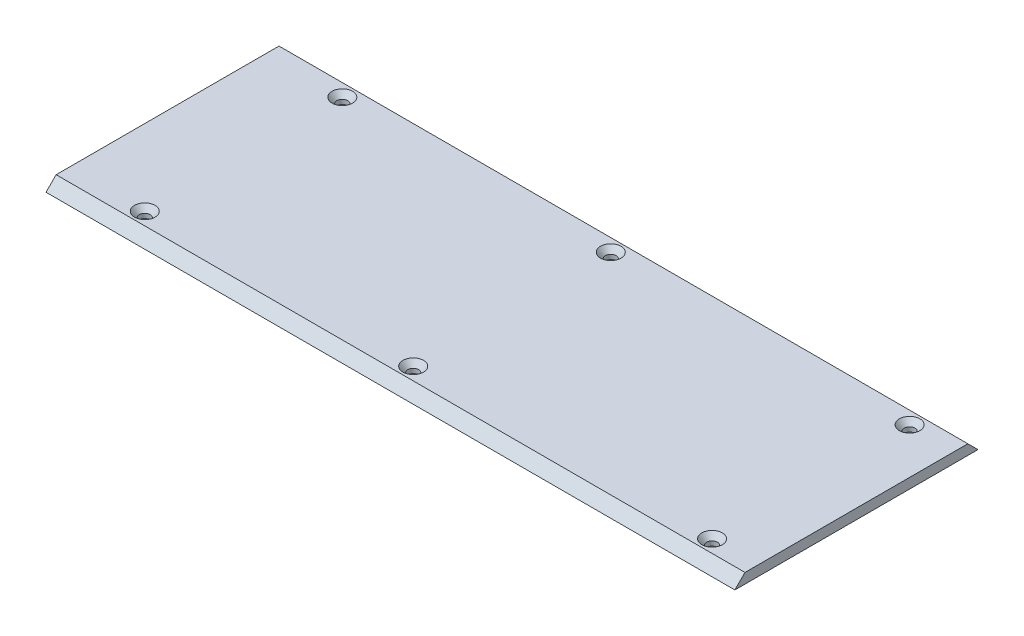
ISO-10303-21;
HEADER;
FILE_DESCRIPTION(('STEP AP214'),'2;1');
FILE_NAME('part.step','',(''),(''),'','','');
FILE_SCHEMA(('AUTOMOTIVE_DESIGN { 1 0 10303 214 1 1 1 1 }'));
ENDSEC;
DATA;
#1=APPLICATION_CONTEXT('core data for automotive mechanical design processes');
#2=APPLICATION_PROTOCOL_DEFINITION('international standard','automotive_design',2000,#1);
#3=PRODUCT_CONTEXT('',#1,'mechanical');
#4=PRODUCT('Part','Part','',(#3));
#5=PRODUCT_RELATED_PRODUCT_CATEGORY('part','',(#4));
#6=PRODUCT_DEFINITION_FORMATION('','',#4);
#7=PRODUCT_DEFINITION_CONTEXT('part definition',#1,'design');
#8=PRODUCT_DEFINITION('design','',#6,#7);
#9=PRODUCT_DEFINITION_SHAPE('','',#8);
#10=(LENGTH_UNIT() NAMED_UNIT(*) SI_UNIT(.MILLI.,.METRE.));
#11=(NAMED_UNIT(*) PLANE_ANGLE_UNIT() SI_UNIT($,.RADIAN.));
#12=(NAMED_UNIT(*) SI_UNIT($,.STERADIAN.) SOLID_ANGLE_UNIT());
#13=UNCERTAINTY_MEASURE_WITH_UNIT(LENGTH_MEASURE(1.E-05),#10,'distance_accuracy_value','');
#14=(GEOMETRIC_REPRESENTATION_CONTEXT(3) GLOBAL_UNCERTAINTY_ASSIGNED_CONTEXT((#13)) GLOBAL_UNIT_ASSIGNED_CONTEXT((#10,
#11,#12)) REPRESENTATION_CONTEXT('',''));
#15=CARTESIAN_POINT('',(0.,0.,0.));
#16=DIRECTION('',(0.,0.,1.));
#17=DIRECTION('',(1.,0.,0.));
#18=AXIS2_PLACEMENT_3D('',#15,#16,#17);
#19=CARTESIAN_POINT('',(215.9,6.35,76.2));
#20=DIRECTION('',(-1.,0.,0.));
#21=DIRECTION('',(0.,0.,1.));
#22=AXIS2_PLACEMENT_3D('',#19,#20,#21);
#23=PLANE('',#22);
#24=DIRECTION('',(0.,0.,-1.));
#25=VECTOR('',#24,1.);
#26=CARTESIAN_POINT('',(215.9,0.,76.2));
#27=LINE('',#26,#25);
#28=CARTESIAN_POINT('',(215.9,0.,76.2));
#29=VERTEX_POINT('',#28);
#30=CARTESIAN_POINT('',(215.9,0.,-76.2));
#31=VERTEX_POINT('',#30);
#32=EDGE_CURVE('E86',#29,#31,#27,.T.);
#33=ORIENTED_EDGE('',*,*,#32,.T.);
#34=DIRECTION('',(0.,-0.707106781186548,-0.707106781186548));
#35=VECTOR('',#34,1.);
#36=CARTESIAN_POINT('',(215.9,6.35,-69.85));
#37=LINE('',#36,#35);
#38=CARTESIAN_POINT('',(215.9,6.35,-69.8499999999999));
#39=VERTEX_POINT('',#38);
#40=EDGE_CURVE('E11',#31,#39,#37,.F.);
#41=ORIENTED_EDGE('',*,*,#40,.T.);
#42=DIRECTION('',(0.,0.,-1.));
#43=VECTOR('',#42,1.);
#44=CARTESIAN_POINT('',(215.9,6.35,76.2));
#45=LINE('',#44,#43);
#46=CARTESIAN_POINT('',(215.9,6.35,69.85));
#47=VERTEX_POINT('',#46);
#48=EDGE_CURVE('E122',#47,#39,#45,.T.);
#49=ORIENTED_EDGE('',*,*,#48,.F.);
#50=DIRECTION('',(0.,0.707106781186548,-0.707106781186548));
#51=VECTOR('',#50,1.);
#52=CARTESIAN_POINT('',(215.9,6.35,69.85));
#53=LINE('',#52,#51);
#54=EDGE_CURVE('E48',#47,#29,#53,.F.);
#55=ORIENTED_EDGE('',*,*,#54,.T.);
#56=EDGE_LOOP('',(#33,#41,#49,#55));
#57=FACE_BOUND('',#56,.T.);
#58=ADVANCED_FACE('F38',(#57),#23,.F.);
#59=CARTESIAN_POINT('',(-215.9,6.35,76.2));
#60=DIRECTION('',(1.,0.,0.));
#61=DIRECTION('',(0.,0.,-1.));
#62=AXIS2_PLACEMENT_3D('',#59,#60,#61);
#63=PLANE('',#62);
#64=DIRECTION('',(0.,0.,1.));
#65=VECTOR('',#64,1.);
#66=CARTESIAN_POINT('',(-215.9,6.35,76.2));
#67=LINE('',#66,#65);
#68=CARTESIAN_POINT('',(-215.9,6.35,-69.8499999999999));
#69=VERTEX_POINT('',#68);
#70=CARTESIAN_POINT('',(-215.9,6.35,69.85));
#71=VERTEX_POINT('',#70);
#72=EDGE_CURVE('E109',#69,#71,#67,.T.);
#73=ORIENTED_EDGE('',*,*,#72,.F.);
#74=DIRECTION('',(0.,0.707106781186548,0.707106781186548));
#75=VECTOR('',#74,1.);
#76=CARTESIAN_POINT('',(-215.9,6.35,-69.85));
#77=LINE('',#76,#75);
#78=CARTESIAN_POINT('',(-215.9,0.,-76.2));
#79=VERTEX_POINT('',#78);
#80=EDGE_CURVE('E63',#69,#79,#77,.F.);
#81=ORIENTED_EDGE('',*,*,#80,.T.);
#82=DIRECTION('',(0.,0.,1.));
#83=VECTOR('',#82,1.);
#84=CARTESIAN_POINT('',(-215.9,0.,76.2));
#85=LINE('',#84,#83);
#86=CARTESIAN_POINT('',(-215.9,0.,76.2));
#87=VERTEX_POINT('',#86);
#88=EDGE_CURVE('E88',#79,#87,#85,.T.);
#89=ORIENTED_EDGE('',*,*,#88,.T.);
#90=DIRECTION('',(0.,-0.707106781186548,0.707106781186548));
#91=VECTOR('',#90,1.);
#92=CARTESIAN_POINT('',(-215.9,6.35,69.85));
#93=LINE('',#92,#91);
#94=EDGE_CURVE('E55',#87,#71,#93,.F.);
#95=ORIENTED_EDGE('',*,*,#94,.T.);
#96=EDGE_LOOP('',(#73,#81,#89,#95));
#97=FACE_BOUND('',#96,.T.);
#98=ADVANCED_FACE('F119',(#97),#63,.F.);
#99=CARTESIAN_POINT('',(0.,6.35,0.));
#100=DIRECTION('',(0.,-1.,0.));
#101=DIRECTION('',(0.,0.,-1.));
#102=AXIS2_PLACEMENT_3D('',#99,#100,#101);
#103=PLANE('',#102);
#104=CARTESIAN_POINT('',(187.325,6.35,61.9125));
#105=DIRECTION('',(0.,1.,0.));
#106=DIRECTION('',(0.,0.,1.));
#107=AXIS2_PLACEMENT_3D('',#104,#105,#106);
#108=CIRCLE('',#107,6.4389);
#109=CARTESIAN_POINT('',(187.325,6.35,68.3514));
#110=VERTEX_POINT('',#109);
#111=EDGE_CURVE('E219',#110,#110,#108,.T.);
#112=ORIENTED_EDGE('',*,*,#111,.F.);
#113=EDGE_LOOP('',(#112));
#114=FACE_BOUND('',#113,.T.);
#115=CARTESIAN_POINT('',(0.,6.35,61.9125));
#116=DIRECTION('',(0.,1.,0.));
#117=DIRECTION('',(0.,0.,1.));
#118=AXIS2_PLACEMENT_3D('',#115,#116,#117);
#119=CIRCLE('',#118,6.4389);
#120=CARTESIAN_POINT('',(0.,6.35,68.3514));
#121=VERTEX_POINT('',#120);
#122=EDGE_CURVE('E230',#121,#121,#119,.T.);
#123=ORIENTED_EDGE('',*,*,#122,.F.);
#124=EDGE_LOOP('',(#123));
#125=FACE_BOUND('',#124,.T.);
#126=CARTESIAN_POINT('',(-168.275,6.35,61.9125));
#127=DIRECTION('',(0.,1.,0.));
#128=DIRECTION('',(0.,0.,1.));
#129=AXIS2_PLACEMENT_3D('',#126,#127,#128);
#130=CIRCLE('',#129,6.4389);
#131=CARTESIAN_POINT('',(-168.275,6.35,68.3514));
#132=VERTEX_POINT('',#131);
#133=EDGE_CURVE('E242',#132,#132,#130,.T.);
#134=ORIENTED_EDGE('',*,*,#133,.F.);
#135=EDGE_LOOP('',(#134));
#136=FACE_BOUND('',#135,.T.);
#137=CARTESIAN_POINT('',(-168.275,6.35,-61.9125));
#138=DIRECTION('',(0.,1.,0.));
#139=DIRECTION('',(0.,0.,1.));
#140=AXIS2_PLACEMENT_3D('',#137,#138,#139);
#141=CIRCLE('',#140,6.4389);
#142=CARTESIAN_POINT('',(-168.275,6.35,-55.4736));
#143=VERTEX_POINT('',#142);
#144=EDGE_CURVE('E254',#143,#143,#141,.T.);
#145=ORIENTED_EDGE('',*,*,#144,.F.);
#146=EDGE_LOOP('',(#145));
#147=FACE_BOUND('',#146,.T.);
#148=CARTESIAN_POINT('',(187.325,6.35,-61.9125));
#149=DIRECTION('',(0.,1.,0.));
#150=DIRECTION('',(0.,0.,1.));
#151=AXIS2_PLACEMENT_3D('',#148,#149,#150);
#152=CIRCLE('',#151,6.4389);
#153=CARTESIAN_POINT('',(187.325,6.35,-55.4736));
#154=VERTEX_POINT('',#153);
#155=EDGE_CURVE('E266',#154,#154,#152,.T.);
#156=ORIENTED_EDGE('',*,*,#155,.F.);
#157=EDGE_LOOP('',(#156));
#158=FACE_BOUND('',#157,.T.);
#159=CARTESIAN_POINT('',(0.,6.35,-61.9125));
#160=DIRECTION('',(0.,1.,0.));
#161=DIRECTION('',(0.,0.,1.));
#162=AXIS2_PLACEMENT_3D('',#159,#160,#161);
#163=CIRCLE('',#162,6.4389);
#164=CARTESIAN_POINT('',(0.,6.35,-55.4736));
#165=VERTEX_POINT('',#164);
#166=EDGE_CURVE('E278',#165,#165,#163,.T.);
#167=ORIENTED_EDGE('',*,*,#166,.F.);
#168=EDGE_LOOP('',(#167));
#169=FACE_BOUND('',#168,.T.);
#170=ORIENTED_EDGE('',*,*,#48,.T.);
#171=DIRECTION('',(-1.,0.,0.));
#172=VECTOR('',#171,1.);
#173=CARTESIAN_POINT('',(0.,6.35,-69.85));
#174=LINE('',#173,#172);
#175=EDGE_CURVE('E99',#39,#69,#174,.T.);
#176=ORIENTED_EDGE('',*,*,#175,.T.);
#177=ORIENTED_EDGE('',*,*,#72,.T.);
#178=DIRECTION('',(1.,0.,0.));
#179=VECTOR('',#178,1.);
#180=CARTESIAN_POINT('',(0.,6.35,69.85));
#181=LINE('',#180,#179);
#182=EDGE_CURVE('E102',#71,#47,#181,.T.);
#183=ORIENTED_EDGE('',*,*,#182,.T.);
#184=EDGE_LOOP('',(#170,#176,#177,#183));
#185=FACE_BOUND('',#184,.T.);
#186=ADVANCED_FACE('F134',(#114,#125,#136,#147,#158,#169,#185),#103,.F.);
#187=CARTESIAN_POINT('',(0.,0.,0.));
#188=DIRECTION('',(0.,-1.,0.));
#189=DIRECTION('',(0.,0.,-1.));
#190=AXIS2_PLACEMENT_3D('',#187,#188,#189);
#191=PLANE('',#190);
#192=CARTESIAN_POINT('',(187.325,0.,61.9125));
#193=DIRECTION('',(0.,1.,0.));
#194=DIRECTION('',(0.,0.,1.));
#195=AXIS2_PLACEMENT_3D('',#192,#193,#194);
#196=CIRCLE('',#195,3.3782);
#197=CARTESIAN_POINT('',(187.325,0.,65.2907));
#198=VERTEX_POINT('',#197);
#199=EDGE_CURVE('E224',#198,#198,#196,.T.);
#200=ORIENTED_EDGE('',*,*,#199,.T.);
#201=EDGE_LOOP('',(#200));
#202=FACE_BOUND('',#201,.T.);
#203=CARTESIAN_POINT('',(0.,0.,61.9125));
#204=DIRECTION('',(0.,1.,0.));
#205=DIRECTION('',(0.,0.,1.));
#206=AXIS2_PLACEMENT_3D('',#203,#204,#205);
#207=CIRCLE('',#206,3.3782);
#208=CARTESIAN_POINT('',(0.,0.,65.2907));
#209=VERTEX_POINT('',#208);
#210=EDGE_CURVE('E238',#209,#209,#207,.T.);
#211=ORIENTED_EDGE('',*,*,#210,.T.);
#212=EDGE_LOOP('',(#211));
#213=FACE_BOUND('',#212,.T.);
#214=CARTESIAN_POINT('',(-168.275,0.,61.9125));
#215=DIRECTION('',(0.,1.,0.));
#216=DIRECTION('',(0.,0.,1.));
#217=AXIS2_PLACEMENT_3D('',#214,#215,#216);
#218=CIRCLE('',#217,3.3782);
#219=CARTESIAN_POINT('',(-168.275,0.,65.2907));
#220=VERTEX_POINT('',#219);
#221=EDGE_CURVE('E250',#220,#220,#218,.T.);
#222=ORIENTED_EDGE('',*,*,#221,.T.);
#223=EDGE_LOOP('',(#222));
#224=FACE_BOUND('',#223,.T.);
#225=CARTESIAN_POINT('',(-168.275,0.,-61.9125));
#226=DIRECTION('',(0.,1.,0.));
#227=DIRECTION('',(0.,0.,1.));
#228=AXIS2_PLACEMENT_3D('',#225,#226,#227);
#229=CIRCLE('',#228,3.3782);
#230=CARTESIAN_POINT('',(-168.275,0.,-58.5343));
#231=VERTEX_POINT('',#230);
#232=EDGE_CURVE('E262',#231,#231,#229,.T.);
#233=ORIENTED_EDGE('',*,*,#232,.T.);
#234=EDGE_LOOP('',(#233));
#235=FACE_BOUND('',#234,.T.);
#236=CARTESIAN_POINT('',(187.325,0.,-61.9125));
#237=DIRECTION('',(0.,1.,0.));
#238=DIRECTION('',(0.,0.,1.));
#239=AXIS2_PLACEMENT_3D('',#236,#237,#238);
#240=CIRCLE('',#239,3.3782);
#241=CARTESIAN_POINT('',(187.325,0.,-58.5343));
#242=VERTEX_POINT('',#241);
#243=EDGE_CURVE('E274',#242,#242,#240,.T.);
#244=ORIENTED_EDGE('',*,*,#243,.T.);
#245=EDGE_LOOP('',(#244));
#246=FACE_BOUND('',#245,.T.);
#247=CARTESIAN_POINT('',(0.,0.,-61.9125));
#248=DIRECTION('',(0.,1.,0.));
#249=DIRECTION('',(0.,0.,1.));
#250=AXIS2_PLACEMENT_3D('',#247,#248,#249);
#251=CIRCLE('',#250,3.3782);
#252=CARTESIAN_POINT('',(0.,0.,-58.5343));
#253=VERTEX_POINT('',#252);
#254=EDGE_CURVE('E96',#253,#253,#251,.T.);
#255=ORIENTED_EDGE('',*,*,#254,.T.);
#256=EDGE_LOOP('',(#255));
#257=FACE_BOUND('',#256,.T.);
#258=ORIENTED_EDGE('',*,*,#32,.F.);
#259=DIRECTION('',(1.,0.,0.));
#260=VECTOR('',#259,1.);
#261=CARTESIAN_POINT('',(-215.9,0.,76.2));
#262=LINE('',#261,#260);
#263=EDGE_CURVE('E126',#87,#29,#262,.T.);
#264=ORIENTED_EDGE('',*,*,#263,.F.);
#265=ORIENTED_EDGE('',*,*,#88,.F.);
#266=DIRECTION('',(-1.,0.,0.));
#267=VECTOR('',#266,1.);
#268=CARTESIAN_POINT('',(-215.9,0.,-76.2));
#269=LINE('',#268,#267);
#270=EDGE_CURVE('E82',#31,#79,#269,.T.);
#271=ORIENTED_EDGE('',*,*,#270,.F.);
#272=EDGE_LOOP('',(#258,#264,#265,#271));
#273=FACE_BOUND('',#272,.T.);
#274=ADVANCED_FACE('F84',(#202,#213,#224,#235,#246,#257,#273),#191,.T.);
#275=CARTESIAN_POINT('',(0.,6.35,-69.85));
#276=DIRECTION('',(0.,-0.707106781186548,0.707106781186548));
#277=DIRECTION('',(-1.,0.,0.));
#278=AXIS2_PLACEMENT_3D('',#275,#276,#277);
#279=PLANE('',#278);
#280=ORIENTED_EDGE('',*,*,#40,.F.);
#281=ORIENTED_EDGE('',*,*,#270,.T.);
#282=ORIENTED_EDGE('',*,*,#80,.F.);
#283=ORIENTED_EDGE('',*,*,#175,.F.);
#284=EDGE_LOOP('',(#280,#281,#282,#283));
#285=FACE_BOUND('',#284,.T.);
#286=ADVANCED_FACE('F98',(#285),#279,.F.);
#287=CARTESIAN_POINT('',(0.,6.35,69.85));
#288=DIRECTION('',(0.,-0.707106781186548,-0.707106781186548));
#289=DIRECTION('',(1.,0.,0.));
#290=AXIS2_PLACEMENT_3D('',#287,#288,#289);
#291=PLANE('',#290);
#292=ORIENTED_EDGE('',*,*,#94,.F.);
#293=ORIENTED_EDGE('',*,*,#263,.T.);
#294=ORIENTED_EDGE('',*,*,#54,.F.);
#295=ORIENTED_EDGE('',*,*,#182,.F.);
#296=EDGE_LOOP('',(#292,#293,#294,#295));
#297=FACE_BOUND('',#296,.T.);
#298=ADVANCED_FACE('F41',(#297),#291,.F.);
#299=CARTESIAN_POINT('',(0.,6.35,-61.9125));
#300=DIRECTION('',(0.,1.,0.));
#301=DIRECTION('',(0.,0.,1.));
#302=AXIS2_PLACEMENT_3D('',#299,#300,#301);
#303=CYLINDRICAL_SURFACE('',#302,3.3782);
#304=ORIENTED_EDGE('',*,*,#254,.F.);
#305=EDGE_LOOP('',(#304));
#306=FACE_BOUND('',#305,.T.);
#307=CARTESIAN_POINT('',(0.,2.82906741601865,-61.9125));
#308=DIRECTION('',(0.,1.,0.));
#309=DIRECTION('',(0.,0.,1.));
#310=AXIS2_PLACEMENT_3D('',#307,#308,#309);
#311=CIRCLE('',#310,3.3782);
#312=CARTESIAN_POINT('',(0.,2.82906741601865,-58.5343));
#313=VERTEX_POINT('',#312);
#314=EDGE_CURVE('E282',#313,#313,#311,.T.);
#315=ORIENTED_EDGE('',*,*,#314,.T.);
#316=EDGE_LOOP('',(#315));
#317=FACE_BOUND('',#316,.T.);
#318=ADVANCED_FACE('F159',(#306,#317),#303,.F.);
#319=CARTESIAN_POINT('',(0.,6.35,-61.9125));
#320=DIRECTION('',(0.,1.,0.));
#321=DIRECTION('',(0.,0.,1.));
#322=AXIS2_PLACEMENT_3D('',#319,#320,#321);
#323=CONICAL_SURFACE('',#322,6.4389,0.715584993317675);
#324=ORIENTED_EDGE('',*,*,#314,.F.);
#325=EDGE_LOOP('',(#324));
#326=FACE_BOUND('',#325,.T.);
#327=ORIENTED_EDGE('',*,*,#166,.T.);
#328=EDGE_LOOP('',(#327));
#329=FACE_BOUND('',#328,.T.);
#330=ADVANCED_FACE('F163',(#326,#329),#323,.F.);
#331=CARTESIAN_POINT('',(187.325,6.35,-61.9125));
#332=DIRECTION('',(0.,1.,0.));
#333=DIRECTION('',(0.,0.,1.));
#334=AXIS2_PLACEMENT_3D('',#331,#332,#333);
#335=CYLINDRICAL_SURFACE('',#334,3.3782);
#336=ORIENTED_EDGE('',*,*,#243,.F.);
#337=EDGE_LOOP('',(#336));
#338=FACE_BOUND('',#337,.T.);
#339=CARTESIAN_POINT('',(187.325,2.82906741601865,-61.9125));
#340=DIRECTION('',(0.,1.,0.));
#341=DIRECTION('',(0.,0.,1.));
#342=AXIS2_PLACEMENT_3D('',#339,#340,#341);
#343=CIRCLE('',#342,3.3782);
#344=CARTESIAN_POINT('',(187.325,2.82906741601865,-58.5343));
#345=VERTEX_POINT('',#344);
#346=EDGE_CURVE('E270',#345,#345,#343,.T.);
#347=ORIENTED_EDGE('',*,*,#346,.T.);
#348=EDGE_LOOP('',(#347));
#349=FACE_BOUND('',#348,.T.);
#350=ADVANCED_FACE('F168',(#338,#349),#335,.F.);
#351=CARTESIAN_POINT('',(187.325,6.35,-61.9125));
#352=DIRECTION('',(0.,1.,0.));
#353=DIRECTION('',(0.,0.,1.));
#354=AXIS2_PLACEMENT_3D('',#351,#352,#353);
#355=CONICAL_SURFACE('',#354,6.4389,0.715584993317675);
#356=ORIENTED_EDGE('',*,*,#346,.F.);
#357=EDGE_LOOP('',(#356));
#358=FACE_BOUND('',#357,.T.);
#359=ORIENTED_EDGE('',*,*,#155,.T.);
#360=EDGE_LOOP('',(#359));
#361=FACE_BOUND('',#360,.T.);
#362=ADVANCED_FACE('F176',(#358,#361),#355,.F.);
#363=CARTESIAN_POINT('',(-168.275,6.35,-61.9125));
#364=DIRECTION('',(0.,1.,0.));
#365=DIRECTION('',(0.,0.,1.));
#366=AXIS2_PLACEMENT_3D('',#363,#364,#365);
#367=CYLINDRICAL_SURFACE('',#366,3.3782);
#368=ORIENTED_EDGE('',*,*,#232,.F.);
#369=EDGE_LOOP('',(#368));
#370=FACE_BOUND('',#369,.T.);
#371=CARTESIAN_POINT('',(-168.275,2.82906741601865,-61.9125));
#372=DIRECTION('',(0.,1.,0.));
#373=DIRECTION('',(0.,0.,1.));
#374=AXIS2_PLACEMENT_3D('',#371,#372,#373);
#375=CIRCLE('',#374,3.3782);
#376=CARTESIAN_POINT('',(-168.275,2.82906741601865,-58.5343));
#377=VERTEX_POINT('',#376);
#378=EDGE_CURVE('E258',#377,#377,#375,.T.);
#379=ORIENTED_EDGE('',*,*,#378,.T.);
#380=EDGE_LOOP('',(#379));
#381=FACE_BOUND('',#380,.T.);
#382=ADVANCED_FACE('F180',(#370,#381),#367,.F.);
#383=CARTESIAN_POINT('',(-168.275,6.35,-61.9125));
#384=DIRECTION('',(0.,1.,0.));
#385=DIRECTION('',(0.,0.,1.));
#386=AXIS2_PLACEMENT_3D('',#383,#384,#385);
#387=CONICAL_SURFACE('',#386,6.4389,0.715584993317675);
#388=ORIENTED_EDGE('',*,*,#378,.F.);
#389=EDGE_LOOP('',(#388));
#390=FACE_BOUND('',#389,.T.);
#391=ORIENTED_EDGE('',*,*,#144,.T.);
#392=EDGE_LOOP('',(#391));
#393=FACE_BOUND('',#392,.T.);
#394=ADVANCED_FACE('F184',(#390,#393),#387,.F.);
#395=CARTESIAN_POINT('',(-168.275,6.35,61.9125));
#396=DIRECTION('',(0.,1.,0.));
#397=DIRECTION('',(0.,0.,1.));
#398=AXIS2_PLACEMENT_3D('',#395,#396,#397);
#399=CYLINDRICAL_SURFACE('',#398,3.3782);
#400=ORIENTED_EDGE('',*,*,#221,.F.);
#401=EDGE_LOOP('',(#400));
#402=FACE_BOUND('',#401,.T.);
#403=CARTESIAN_POINT('',(-168.275,2.82906741601865,61.9125));
#404=DIRECTION('',(0.,1.,0.));
#405=DIRECTION('',(0.,0.,1.));
#406=AXIS2_PLACEMENT_3D('',#403,#404,#405);
#407=CIRCLE('',#406,3.3782);
#408=CARTESIAN_POINT('',(-168.275,2.82906741601865,65.2907));
#409=VERTEX_POINT('',#408);
#410=EDGE_CURVE('E246',#409,#409,#407,.T.);
#411=ORIENTED_EDGE('',*,*,#410,.T.);
#412=EDGE_LOOP('',(#411));
#413=FACE_BOUND('',#412,.T.);
#414=ADVANCED_FACE('F188',(#402,#413),#399,.F.);
#415=CARTESIAN_POINT('',(-168.275,6.35,61.9125));
#416=DIRECTION('',(0.,1.,0.));
#417=DIRECTION('',(0.,0.,1.));
#418=AXIS2_PLACEMENT_3D('',#415,#416,#417);
#419=CONICAL_SURFACE('',#418,6.4389,0.715584993317675);
#420=ORIENTED_EDGE('',*,*,#410,.F.);
#421=EDGE_LOOP('',(#420));
#422=FACE_BOUND('',#421,.T.);
#423=ORIENTED_EDGE('',*,*,#133,.T.);
#424=EDGE_LOOP('',(#423));
#425=FACE_BOUND('',#424,.T.);
#426=ADVANCED_FACE('F192',(#422,#425),#419,.F.);
#427=CARTESIAN_POINT('',(0.,6.35,61.9125));
#428=DIRECTION('',(0.,1.,0.));
#429=DIRECTION('',(0.,0.,1.));
#430=AXIS2_PLACEMENT_3D('',#427,#428,#429);
#431=CYLINDRICAL_SURFACE('',#430,3.3782);
#432=ORIENTED_EDGE('',*,*,#210,.F.);
#433=EDGE_LOOP('',(#432));
#434=FACE_BOUND('',#433,.T.);
#435=CARTESIAN_POINT('',(0.,2.82906741601865,61.9125));
#436=DIRECTION('',(0.,1.,0.));
#437=DIRECTION('',(0.,0.,1.));
#438=AXIS2_PLACEMENT_3D('',#435,#436,#437);
#439=CIRCLE('',#438,3.3782);
#440=CARTESIAN_POINT('',(0.,2.82906741601865,65.2907));
#441=VERTEX_POINT('',#440);
#442=EDGE_CURVE('E234',#441,#441,#439,.T.);
#443=ORIENTED_EDGE('',*,*,#442,.T.);
#444=EDGE_LOOP('',(#443));
#445=FACE_BOUND('',#444,.T.);
#446=ADVANCED_FACE('F196',(#434,#445),#431,.F.);
#447=CARTESIAN_POINT('',(0.,6.35,61.9125));
#448=DIRECTION('',(0.,1.,0.));
#449=DIRECTION('',(0.,0.,1.));
#450=AXIS2_PLACEMENT_3D('',#447,#448,#449);
#451=CONICAL_SURFACE('',#450,6.4389,0.715584993317675);
#452=ORIENTED_EDGE('',*,*,#442,.F.);
#453=EDGE_LOOP('',(#452));
#454=FACE_BOUND('',#453,.T.);
#455=ORIENTED_EDGE('',*,*,#122,.T.);
#456=EDGE_LOOP('',(#455));
#457=FACE_BOUND('',#456,.T.);
#458=ADVANCED_FACE('F200',(#454,#457),#451,.F.);
#459=CARTESIAN_POINT('',(187.325,6.35,61.9125));
#460=DIRECTION('',(0.,1.,0.));
#461=DIRECTION('',(0.,0.,1.));
#462=AXIS2_PLACEMENT_3D('',#459,#460,#461);
#463=CYLINDRICAL_SURFACE('',#462,3.3782);
#464=ORIENTED_EDGE('',*,*,#199,.F.);
#465=EDGE_LOOP('',(#464));
#466=FACE_BOUND('',#465,.T.);
#467=CARTESIAN_POINT('',(187.325,2.82906741601865,61.9125));
#468=DIRECTION('',(0.,1.,0.));
#469=DIRECTION('',(0.,0.,1.));
#470=AXIS2_PLACEMENT_3D('',#467,#468,#469);
#471=CIRCLE('',#470,3.3782);
#472=CARTESIAN_POINT('',(187.325,2.82906741601865,65.2907));
#473=VERTEX_POINT('',#472);
#474=EDGE_CURVE('E217',#473,#473,#471,.T.);
#475=ORIENTED_EDGE('',*,*,#474,.T.);
#476=EDGE_LOOP('',(#475));
#477=FACE_BOUND('',#476,.T.);
#478=ADVANCED_FACE('F204',(#466,#477),#463,.F.);
#479=CARTESIAN_POINT('',(187.325,6.35,61.9125));
#480=DIRECTION('',(0.,1.,0.));
#481=DIRECTION('',(0.,0.,1.));
#482=AXIS2_PLACEMENT_3D('',#479,#480,#481);
#483=CONICAL_SURFACE('',#482,6.4389,0.715584993317675);
#484=ORIENTED_EDGE('',*,*,#474,.F.);
#485=EDGE_LOOP('',(#484));
#486=FACE_BOUND('',#485,.T.);
#487=ORIENTED_EDGE('',*,*,#111,.T.);
#488=EDGE_LOOP('',(#487));
#489=FACE_BOUND('',#488,.T.);
#490=ADVANCED_FACE('F208',(#486,#489),#483,.F.);
#491=CLOSED_SHELL('',(#58,#98,#186,#274,#286,#298,#318,#330,#350,#362,#382,#394,#414,#426,#446,
#458,#478,#490));
#492=MANIFOLD_SOLID_BREP('B2',#491);
#493=ADVANCED_BREP_SHAPE_REPRESENTATION('',(#18,#492),#14);
#494=SHAPE_DEFINITION_REPRESENTATION(#9,#493);
ENDSEC;
END-ISO-10303-21;
